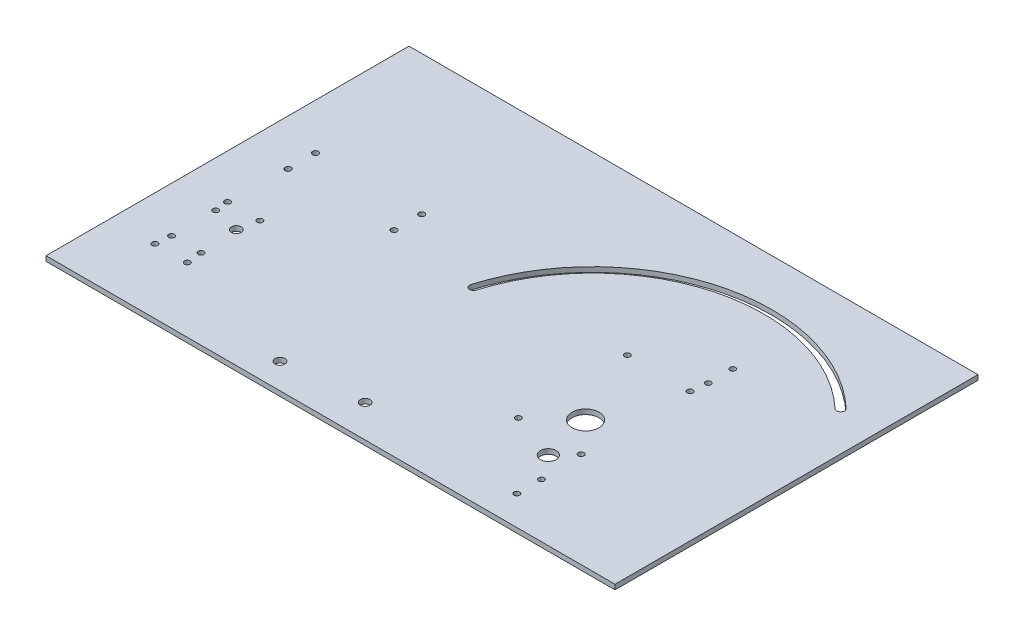
ISO-10303-21;
HEADER;
FILE_DESCRIPTION(('STEP AP214'),'2;1');
FILE_NAME('part.step','',(''),(''),'','','');
FILE_SCHEMA(('AUTOMOTIVE_DESIGN { 1 0 10303 214 1 1 1 1 }'));
ENDSEC;
DATA;
#1=APPLICATION_CONTEXT('core data for automotive mechanical design processes');
#2=APPLICATION_PROTOCOL_DEFINITION('international standard','automotive_design',2000,#1);
#3=PRODUCT_CONTEXT('',#1,'mechanical');
#4=PRODUCT('Part','Part','',(#3));
#5=PRODUCT_RELATED_PRODUCT_CATEGORY('part','',(#4));
#6=PRODUCT_DEFINITION_FORMATION('','',#4);
#7=PRODUCT_DEFINITION_CONTEXT('part definition',#1,'design');
#8=PRODUCT_DEFINITION('design','',#6,#7);
#9=PRODUCT_DEFINITION_SHAPE('','',#8);
#10=(LENGTH_UNIT() NAMED_UNIT(*) SI_UNIT(.MILLI.,.METRE.));
#11=(NAMED_UNIT(*) PLANE_ANGLE_UNIT() SI_UNIT($,.RADIAN.));
#12=(NAMED_UNIT(*) SI_UNIT($,.STERADIAN.) SOLID_ANGLE_UNIT());
#13=UNCERTAINTY_MEASURE_WITH_UNIT(LENGTH_MEASURE(1.E-05),#10,'distance_accuracy_value','');
#14=(GEOMETRIC_REPRESENTATION_CONTEXT(3) GLOBAL_UNCERTAINTY_ASSIGNED_CONTEXT((#13)) GLOBAL_UNIT_ASSIGNED_CONTEXT((#10,
#11,#12)) REPRESENTATION_CONTEXT('',''));
#15=CARTESIAN_POINT('',(0.,0.,0.));
#16=DIRECTION('',(0.,0.,1.));
#17=DIRECTION('',(1.,0.,0.));
#18=AXIS2_PLACEMENT_3D('',#15,#16,#17);
#19=CARTESIAN_POINT('',(0.,3.175,0.));
#20=DIRECTION('',(0.,1.,0.));
#21=DIRECTION('',(0.,0.,1.));
#22=AXIS2_PLACEMENT_3D('',#19,#20,#21);
#23=PLANE('',#22);
#24=CARTESIAN_POINT('',(106.410453434672,3.175,0.373429287609625));
#25=DIRECTION('',(0.,-1.,0.));
#26=DIRECTION('',(0.,0.,1.));
#27=AXIS2_PLACEMENT_3D('',#24,#25,#26);
#28=CIRCLE('',#27,116.205);
#29=CARTESIAN_POINT('',(-5.05726801654176,3.175,-32.4678419952538));
#30=VERTEX_POINT('',#29);
#31=CARTESIAN_POINT('',(185.887196571292,3.175,-84.4030375259801));
#32=VERTEX_POINT('',#31);
#33=EDGE_CURVE('E109',#30,#32,#28,.T.);
#34=ORIENTED_EDGE('',*,*,#33,.T.);
#35=CARTESIAN_POINT('',(184.15,3.175,-82.55));
#36=DIRECTION('',(0.,-1.,0.));
#37=DIRECTION('',(0.,0.,-1.));
#38=AXIS2_PLACEMENT_3D('',#35,#36,#37);
#39=CIRCLE('',#38,2.54);
#40=CARTESIAN_POINT('',(182.412803428708,3.175,-80.6969624740199));
#41=VERTEX_POINT('',#40);
#42=EDGE_CURVE('E118',#32,#41,#39,.T.);
#43=ORIENTED_EDGE('',*,*,#42,.T.);
#44=CARTESIAN_POINT('',(106.410453434672,3.175,0.373429287609625));
#45=DIRECTION('',(0.,1.,0.));
#46=DIRECTION('',(0.,0.,1.));
#47=AXIS2_PLACEMENT_3D('',#44,#45,#46);
#48=CIRCLE('',#47,111.125);
#49=CARTESIAN_POINT('',(-0.184362160750962,3.175,-31.0321580047462));
#50=VERTEX_POINT('',#49);
#51=EDGE_CURVE('E57',#41,#50,#48,.T.);
#52=ORIENTED_EDGE('',*,*,#51,.T.);
#53=CARTESIAN_POINT('',(-2.62081508864638,3.175,-31.75));
#54=DIRECTION('',(0.,-1.,0.));
#55=DIRECTION('',(0.,0.,-1.));
#56=AXIS2_PLACEMENT_3D('',#53,#54,#55);
#57=CIRCLE('',#56,2.54000000000001);
#58=EDGE_CURVE('E115',#50,#30,#57,.T.);
#59=ORIENTED_EDGE('',*,*,#58,.T.);
#60=EDGE_LOOP('',(#34,#43,#52,#59));
#61=FACE_BOUND('',#60,.T.);
#62=DIRECTION('',(1.,0.,0.));
#63=VECTOR('',#62,1.);
#64=CARTESIAN_POINT('',(-158.75,3.175,-146.05));
#65=LINE('',#64,#63);
#66=CARTESIAN_POINT('',(-158.75,3.175,-146.05));
#67=VERTEX_POINT('',#66);
#68=CARTESIAN_POINT('',(209.55,3.175,-146.05));
#69=VERTEX_POINT('',#68);
#70=EDGE_CURVE('E143',#67,#69,#65,.T.);
#71=ORIENTED_EDGE('',*,*,#70,.F.);
#72=DIRECTION('',(0.,0.,1.));
#73=VECTOR('',#72,1.);
#74=CARTESIAN_POINT('',(-158.75,3.175,-88.9));
#75=LINE('',#74,#73);
#76=CARTESIAN_POINT('',(-158.75,3.175,88.9));
#77=VERTEX_POINT('',#76);
#78=EDGE_CURVE('E307',#67,#77,#75,.T.);
#79=ORIENTED_EDGE('',*,*,#78,.T.);
#80=DIRECTION('',(1.,0.,0.));
#81=VECTOR('',#80,1.);
#82=CARTESIAN_POINT('',(-158.75,3.175,88.9));
#83=LINE('',#82,#81);
#84=CARTESIAN_POINT('',(209.55,3.175,88.9));
#85=VERTEX_POINT('',#84);
#86=EDGE_CURVE('E50',#77,#85,#83,.T.);
#87=ORIENTED_EDGE('',*,*,#86,.T.);
#88=DIRECTION('',(0.,0.,1.));
#89=VECTOR('',#88,1.);
#90=CARTESIAN_POINT('',(209.55,3.175,-146.05));
#91=LINE('',#90,#89);
#92=EDGE_CURVE('E146',#69,#85,#91,.T.);
#93=ORIENTED_EDGE('',*,*,#92,.F.);
#94=EDGE_LOOP('',(#71,#79,#87,#93));
#95=FACE_BOUND('',#94,.T.);
#96=CARTESIAN_POINT('',(-129.2225,3.175,37.1475));
#97=DIRECTION('',(0.,1.,0.));
#98=DIRECTION('',(0.,0.,1.));
#99=AXIS2_PLACEMENT_3D('',#96,#97,#98);
#100=CIRCLE('',#99,1.84149999999993);
#101=CARTESIAN_POINT('',(-129.2225,3.175,38.989));
#102=VERTEX_POINT('',#101);
#103=EDGE_CURVE('E187',#102,#102,#100,.T.);
#104=ORIENTED_EDGE('',*,*,#103,.F.);
#105=EDGE_LOOP('',(#104));
#106=FACE_BOUND('',#105,.T.);
#107=CARTESIAN_POINT('',(-130.175,3.175,46.99));
#108=DIRECTION('',(0.,1.,0.));
#109=DIRECTION('',(0.,0.,1.));
#110=AXIS2_PLACEMENT_3D('',#107,#108,#109);
#111=CIRCLE('',#110,1.84149999999999);
#112=CARTESIAN_POINT('',(-130.175,3.175,48.8315));
#113=VERTEX_POINT('',#112);
#114=EDGE_CURVE('E194',#113,#113,#111,.T.);
#115=ORIENTED_EDGE('',*,*,#114,.F.);
#116=EDGE_LOOP('',(#115));
#117=FACE_BOUND('',#116,.T.);
#118=CARTESIAN_POINT('',(-110.1725,3.175,37.1475));
#119=DIRECTION('',(0.,1.,0.));
#120=DIRECTION('',(0.,0.,1.));
#121=AXIS2_PLACEMENT_3D('',#118,#119,#120);
#122=CIRCLE('',#121,1.84149999999996);
#123=CARTESIAN_POINT('',(-110.1725,3.175,38.989));
#124=VERTEX_POINT('',#123);
#125=EDGE_CURVE('E175',#124,#124,#122,.T.);
#126=ORIENTED_EDGE('',*,*,#125,.F.);
#127=EDGE_LOOP('',(#126));
#128=FACE_BOUND('',#127,.T.);
#129=CARTESIAN_POINT('',(-129.2225,3.175,8.57250000000002));
#130=DIRECTION('',(0.,1.,0.));
#131=DIRECTION('',(0.,0.,1.));
#132=AXIS2_PLACEMENT_3D('',#129,#130,#131);
#133=CIRCLE('',#132,1.84150000000002);
#134=CARTESIAN_POINT('',(-129.2225,3.175,10.414));
#135=VERTEX_POINT('',#134);
#136=EDGE_CURVE('E182',#135,#135,#133,.T.);
#137=ORIENTED_EDGE('',*,*,#136,.F.);
#138=EDGE_LOOP('',(#137));
#139=FACE_BOUND('',#138,.T.);
#140=CARTESIAN_POINT('',(85.0900000000001,3.175,-43.4975));
#141=DIRECTION('',(0.,1.,0.));
#142=DIRECTION('',(0.,0.,1.));
#143=AXIS2_PLACEMENT_3D('',#140,#141,#142);
#144=CIRCLE('',#143,1.84150000000004);
#145=CARTESIAN_POINT('',(85.0900000000001,3.175,-41.6559999999999));
#146=VERTEX_POINT('',#145);
#147=EDGE_CURVE('E211',#146,#146,#144,.T.);
#148=ORIENTED_EDGE('',*,*,#147,.F.);
#149=EDGE_LOOP('',(#148));
#150=FACE_BOUND('',#149,.T.);
#151=CARTESIAN_POINT('',(85.0900000000001,3.175,26.9875));
#152=DIRECTION('',(0.,1.,0.));
#153=DIRECTION('',(0.,0.,1.));
#154=AXIS2_PLACEMENT_3D('',#151,#152,#153);
#155=CIRCLE('',#154,1.84149999999996);
#156=CARTESIAN_POINT('',(85.0900000000001,3.175,28.829));
#157=VERTEX_POINT('',#156);
#158=EDGE_CURVE('E218',#157,#157,#155,.T.);
#159=ORIENTED_EDGE('',*,*,#158,.F.);
#160=EDGE_LOOP('',(#159));
#161=FACE_BOUND('',#160,.T.);
#162=CARTESIAN_POINT('',(125.73,3.175,26.9875));
#163=DIRECTION('',(0.,1.,0.));
#164=DIRECTION('',(0.,0.,1.));
#165=AXIS2_PLACEMENT_3D('',#162,#163,#164);
#166=CIRCLE('',#165,1.84149999999999);
#167=CARTESIAN_POINT('',(125.73,3.175,28.829));
#168=VERTEX_POINT('',#167);
#169=EDGE_CURVE('E199',#168,#168,#166,.T.);
#170=ORIENTED_EDGE('',*,*,#169,.F.);
#171=EDGE_LOOP('',(#170));
#172=FACE_BOUND('',#171,.T.);
#173=CARTESIAN_POINT('',(-109.22,3.175,46.99));
#174=DIRECTION('',(0.,1.,0.));
#175=DIRECTION('',(0.,0.,1.));
#176=AXIS2_PLACEMENT_3D('',#173,#174,#175);
#177=CIRCLE('',#176,1.8415);
#178=CARTESIAN_POINT('',(-109.22,3.175,48.8315));
#179=VERTEX_POINT('',#178);
#180=EDGE_CURVE('E206',#179,#179,#177,.T.);
#181=ORIENTED_EDGE('',*,*,#180,.F.);
#182=EDGE_LOOP('',(#181));
#183=FACE_BOUND('',#182,.T.);
#184=CARTESIAN_POINT('',(-130.175,3.175,0.));
#185=DIRECTION('',(0.,1.,0.));
#186=DIRECTION('',(0.,0.,1.));
#187=AXIS2_PLACEMENT_3D('',#184,#185,#186);
#188=CIRCLE('',#187,1.84149999999999);
#189=CARTESIAN_POINT('',(-130.175,3.175,1.8415));
#190=VERTEX_POINT('',#189);
#191=EDGE_CURVE('E163',#190,#190,#188,.T.);
#192=ORIENTED_EDGE('',*,*,#191,.F.);
#193=EDGE_LOOP('',(#192));
#194=FACE_BOUND('',#193,.T.);
#195=CARTESIAN_POINT('',(-109.22,3.175,0.));
#196=DIRECTION('',(0.,1.,0.));
#197=DIRECTION('',(0.,0.,1.));
#198=AXIS2_PLACEMENT_3D('',#195,#196,#197);
#199=CIRCLE('',#198,1.8415);
#200=CARTESIAN_POINT('',(-109.22,3.175,1.84150000000001));
#201=VERTEX_POINT('',#200);
#202=EDGE_CURVE('E170',#201,#201,#199,.T.);
#203=ORIENTED_EDGE('',*,*,#202,.F.);
#204=EDGE_LOOP('',(#203));
#205=FACE_BOUND('',#204,.T.);
#206=CARTESIAN_POINT('',(125.73,3.175,-43.4975));
#207=DIRECTION('',(0.,1.,0.));
#208=DIRECTION('',(0.,0.,1.));
#209=AXIS2_PLACEMENT_3D('',#206,#207,#208);
#210=CIRCLE('',#209,1.84150000000002);
#211=CARTESIAN_POINT('',(125.73,3.175,-41.6559999999999));
#212=VERTEX_POINT('',#211);
#213=EDGE_CURVE('E214',#212,#212,#210,.T.);
#214=ORIENTED_EDGE('',*,*,#213,.F.);
#215=EDGE_LOOP('',(#214));
#216=FACE_BOUND('',#215,.T.);
#217=CARTESIAN_POINT('',(127.,3.175,69.85));
#218=DIRECTION('',(0.,-1.,0.));
#219=DIRECTION('',(0.,0.,-1.));
#220=AXIS2_PLACEMENT_3D('',#217,#218,#219);
#221=CIRCLE('',#220,1.80340000000001);
#222=CARTESIAN_POINT('',(127.,3.175,68.0466));
#223=VERTEX_POINT('',#222);
#224=EDGE_CURVE('E229',#223,#223,#221,.T.);
#225=ORIENTED_EDGE('',*,*,#224,.T.);
#226=EDGE_LOOP('',(#225));
#227=FACE_BOUND('',#226,.T.);
#228=CARTESIAN_POINT('',(127.,3.175,53.975));
#229=DIRECTION('',(0.,-1.,0.));
#230=DIRECTION('',(0.,0.,-1.));
#231=AXIS2_PLACEMENT_3D('',#228,#229,#230);
#232=CIRCLE('',#231,1.80340000000001);
#233=CARTESIAN_POINT('',(127.,3.175,52.1716));
#234=VERTEX_POINT('',#233);
#235=EDGE_CURVE('E239',#234,#234,#232,.T.);
#236=ORIENTED_EDGE('',*,*,#235,.T.);
#237=EDGE_LOOP('',(#236));
#238=FACE_BOUND('',#237,.T.);
#239=CARTESIAN_POINT('',(127.,3.175,-53.975));
#240=DIRECTION('',(0.,-1.,0.));
#241=DIRECTION('',(0.,0.,-1.));
#242=AXIS2_PLACEMENT_3D('',#239,#240,#241);
#243=CIRCLE('',#242,1.80340000000001);
#244=CARTESIAN_POINT('',(127.,3.175,-55.7784));
#245=VERTEX_POINT('',#244);
#246=EDGE_CURVE('E245',#245,#245,#243,.T.);
#247=ORIENTED_EDGE('',*,*,#246,.T.);
#248=EDGE_LOOP('',(#247));
#249=FACE_BOUND('',#248,.T.);
#250=CARTESIAN_POINT('',(127.,3.175,-69.85));
#251=DIRECTION('',(0.,-1.,0.));
#252=DIRECTION('',(0.,0.,-1.));
#253=AXIS2_PLACEMENT_3D('',#250,#251,#252);
#254=CIRCLE('',#253,1.80340000000001);
#255=CARTESIAN_POINT('',(127.,3.175,-71.6534));
#256=VERTEX_POINT('',#255);
#257=EDGE_CURVE('E226',#256,#256,#254,.T.);
#258=ORIENTED_EDGE('',*,*,#257,.T.);
#259=EDGE_LOOP('',(#258));
#260=FACE_BOUND('',#259,.T.);
#261=CARTESIAN_POINT('',(115.57,3.175,38.1));
#262=DIRECTION('',(0.,1.,0.));
#263=DIRECTION('',(0.,0.,1.));
#264=AXIS2_PLACEMENT_3D('',#261,#262,#263);
#265=CIRCLE('',#264,5.08000000000001);
#266=CARTESIAN_POINT('',(115.57,3.175,43.18));
#267=VERTEX_POINT('',#266);
#268=EDGE_CURVE('E232',#267,#267,#265,.T.);
#269=ORIENTED_EDGE('',*,*,#268,.F.);
#270=EDGE_LOOP('',(#269));
#271=FACE_BOUND('',#270,.T.);
#272=CARTESIAN_POINT('',(-23.829539608584,3.175,72.39));
#273=DIRECTION('',(0.,-1.,0.));
#274=DIRECTION('',(0.,0.,-1.));
#275=AXIS2_PLACEMENT_3D('',#272,#273,#274);
#276=CIRCLE('',#275,3.175);
#277=CARTESIAN_POINT('',(-23.829539608584,3.175,69.215));
#278=VERTEX_POINT('',#277);
#279=EDGE_CURVE('E259',#278,#278,#276,.T.);
#280=ORIENTED_EDGE('',*,*,#279,.T.);
#281=EDGE_LOOP('',(#280));
#282=FACE_BOUND('',#281,.T.);
#283=CARTESIAN_POINT('',(26.764302072,3.175,67.818));
#284=DIRECTION('',(0.,-1.,0.));
#285=DIRECTION('',(0.,0.,-1.));
#286=AXIS2_PLACEMENT_3D('',#283,#284,#285);
#287=CIRCLE('',#286,3.175);
#288=CARTESIAN_POINT('',(26.764302072,3.175,64.643));
#289=VERTEX_POINT('',#288);
#290=EDGE_CURVE('E266',#289,#289,#287,.T.);
#291=ORIENTED_EDGE('',*,*,#290,.T.);
#292=EDGE_LOOP('',(#291));
#293=FACE_BOUND('',#292,.T.);
#294=CARTESIAN_POINT('',(-129.032,3.175,-38.1));
#295=DIRECTION('',(0.,1.,0.));
#296=DIRECTION('',(0.,0.,1.));
#297=AXIS2_PLACEMENT_3D('',#294,#295,#296);
#298=CIRCLE('',#297,1.90499999999999);
#299=CARTESIAN_POINT('',(-129.032,3.175,-36.195));
#300=VERTEX_POINT('',#299);
#301=EDGE_CURVE('E277',#300,#300,#298,.T.);
#302=ORIENTED_EDGE('',*,*,#301,.F.);
#303=EDGE_LOOP('',(#302));
#304=FACE_BOUND('',#303,.T.);
#305=CARTESIAN_POINT('',(-129.032,3.175,-55.88));
#306=DIRECTION('',(0.,1.,0.));
#307=DIRECTION('',(0.,0.,1.));
#308=AXIS2_PLACEMENT_3D('',#305,#306,#307);
#309=CIRCLE('',#308,1.90499999999999);
#310=CARTESIAN_POINT('',(-129.032,3.175,-53.975));
#311=VERTEX_POINT('',#310);
#312=EDGE_CURVE('E289',#311,#311,#309,.T.);
#313=ORIENTED_EDGE('',*,*,#312,.F.);
#314=EDGE_LOOP('',(#313));
#315=FACE_BOUND('',#314,.T.);
#316=CARTESIAN_POINT('',(-111.76,3.175,12.7));
#317=DIRECTION('',(0.,1.,0.));
#318=DIRECTION('',(0.,0.,1.));
#319=AXIS2_PLACEMENT_3D('',#316,#317,#318);
#320=CIRCLE('',#319,3.175);
#321=CARTESIAN_POINT('',(-111.76,3.175,15.875));
#322=VERTEX_POINT('',#321);
#323=EDGE_CURVE('E301',#322,#322,#320,.T.);
#324=ORIENTED_EDGE('',*,*,#323,.F.);
#325=EDGE_LOOP('',(#324));
#326=FACE_BOUND('',#325,.T.);
#327=CARTESIAN_POINT('',(107.95,3.175,6.35000000000002));
#328=DIRECTION('',(0.,1.,0.));
#329=DIRECTION('',(0.,0.,1.));
#330=AXIS2_PLACEMENT_3D('',#327,#328,#329);
#331=CIRCLE('',#330,8.73125);
#332=CARTESIAN_POINT('',(107.95,3.175,15.08125));
#333=VERTEX_POINT('',#332);
#334=EDGE_CURVE('E295',#333,#333,#331,.T.);
#335=ORIENTED_EDGE('',*,*,#334,.F.);
#336=EDGE_LOOP('',(#335));
#337=FACE_BOUND('',#336,.T.);
#338=CARTESIAN_POINT('',(-60.452,3.175,-55.88));
#339=DIRECTION('',(0.,1.,0.));
#340=DIRECTION('',(0.,0.,1.));
#341=AXIS2_PLACEMENT_3D('',#338,#339,#340);
#342=CIRCLE('',#341,1.90500000000001);
#343=CARTESIAN_POINT('',(-60.452,3.175,-53.975));
#344=VERTEX_POINT('',#343);
#345=EDGE_CURVE('E283',#344,#344,#342,.T.);
#346=ORIENTED_EDGE('',*,*,#345,.F.);
#347=EDGE_LOOP('',(#346));
#348=FACE_BOUND('',#347,.T.);
#349=CARTESIAN_POINT('',(-60.452,3.175,-38.1));
#350=DIRECTION('',(0.,1.,0.));
#351=DIRECTION('',(0.,0.,1.));
#352=AXIS2_PLACEMENT_3D('',#349,#350,#351);
#353=CIRCLE('',#352,1.90500000000001);
#354=CARTESIAN_POINT('',(-60.452,3.175,-36.195));
#355=VERTEX_POINT('',#354);
#356=EDGE_CURVE('E271',#355,#355,#353,.T.);
#357=ORIENTED_EDGE('',*,*,#356,.F.);
#358=EDGE_LOOP('',(#357));
#359=FACE_BOUND('',#358,.T.);
#360=ADVANCED_FACE('F42',(#61,#95,#106,#117,#128,#139,#150,#161,#172,#183,#194,#205,#216,#227,
#238,#249,#260,#271,#282,#293,#304,#315,#326,#337,#348,#359),#23,.T.);
#361=CARTESIAN_POINT('',(0.,0.,0.));
#362=DIRECTION('',(0.,1.,0.));
#363=DIRECTION('',(0.,0.,1.));
#364=AXIS2_PLACEMENT_3D('',#361,#362,#363);
#365=PLANE('',#364);
#366=CARTESIAN_POINT('',(184.15,0.,-82.55));
#367=DIRECTION('',(0.,-1.,0.));
#368=DIRECTION('',(0.,0.,-1.));
#369=AXIS2_PLACEMENT_3D('',#366,#367,#368);
#370=CIRCLE('',#369,2.54);
#371=CARTESIAN_POINT('',(185.887196571292,0.,-84.4030375259801));
#372=VERTEX_POINT('',#371);
#373=CARTESIAN_POINT('',(182.412803428708,0.,-80.6969624740199));
#374=VERTEX_POINT('',#373);
#375=EDGE_CURVE('E133',#372,#374,#370,.T.);
#376=ORIENTED_EDGE('',*,*,#375,.F.);
#377=CARTESIAN_POINT('',(106.410453434672,0.,0.373429287609625));
#378=DIRECTION('',(0.,-1.,0.));
#379=DIRECTION('',(0.,0.,1.));
#380=AXIS2_PLACEMENT_3D('',#377,#378,#379);
#381=CIRCLE('',#380,116.205);
#382=CARTESIAN_POINT('',(-5.05726801654176,0.,-32.4678419952538));
#383=VERTEX_POINT('',#382);
#384=EDGE_CURVE('E65',#383,#372,#381,.T.);
#385=ORIENTED_EDGE('',*,*,#384,.F.);
#386=CARTESIAN_POINT('',(-2.62081508864638,0.,-31.75));
#387=DIRECTION('',(0.,-1.,0.));
#388=DIRECTION('',(0.,0.,-1.));
#389=AXIS2_PLACEMENT_3D('',#386,#387,#388);
#390=CIRCLE('',#389,2.54000000000001);
#391=CARTESIAN_POINT('',(-0.184362160750962,0.,-31.0321580047462));
#392=VERTEX_POINT('',#391);
#393=EDGE_CURVE('E124',#392,#383,#390,.T.);
#394=ORIENTED_EDGE('',*,*,#393,.F.);
#395=CARTESIAN_POINT('',(106.410453434672,0.,0.373429287609625));
#396=DIRECTION('',(0.,1.,0.));
#397=DIRECTION('',(0.,0.,1.));
#398=AXIS2_PLACEMENT_3D('',#395,#396,#397);
#399=CIRCLE('',#398,111.125);
#400=EDGE_CURVE('E127',#374,#392,#399,.T.);
#401=ORIENTED_EDGE('',*,*,#400,.F.);
#402=EDGE_LOOP('',(#376,#385,#394,#401));
#403=FACE_BOUND('',#402,.T.);
#404=DIRECTION('',(0.,0.,1.));
#405=VECTOR('',#404,1.);
#406=CARTESIAN_POINT('',(-158.75,0.,-88.9));
#407=LINE('',#406,#405);
#408=CARTESIAN_POINT('',(-158.75,0.,-146.05));
#409=VERTEX_POINT('',#408);
#410=CARTESIAN_POINT('',(-158.75,0.,88.9));
#411=VERTEX_POINT('',#410);
#412=EDGE_CURVE('E304',#409,#411,#407,.T.);
#413=ORIENTED_EDGE('',*,*,#412,.F.);
#414=DIRECTION('',(1.,0.,0.));
#415=VECTOR('',#414,1.);
#416=CARTESIAN_POINT('',(-158.75,0.,-146.05));
#417=LINE('',#416,#415);
#418=CARTESIAN_POINT('',(209.55,0.,-146.05));
#419=VERTEX_POINT('',#418);
#420=EDGE_CURVE('E139',#409,#419,#417,.T.);
#421=ORIENTED_EDGE('',*,*,#420,.T.);
#422=DIRECTION('',(0.,0.,1.));
#423=VECTOR('',#422,1.);
#424=CARTESIAN_POINT('',(209.55,0.,-146.05));
#425=LINE('',#424,#423);
#426=CARTESIAN_POINT('',(209.55,0.,88.9));
#427=VERTEX_POINT('',#426);
#428=EDGE_CURVE('E147',#419,#427,#425,.T.);
#429=ORIENTED_EDGE('',*,*,#428,.T.);
#430=DIRECTION('',(1.,0.,0.));
#431=VECTOR('',#430,1.);
#432=CARTESIAN_POINT('',(-158.75,0.,88.9));
#433=LINE('',#432,#431);
#434=EDGE_CURVE('E309',#411,#427,#433,.T.);
#435=ORIENTED_EDGE('',*,*,#434,.F.);
#436=EDGE_LOOP('',(#413,#421,#429,#435));
#437=FACE_BOUND('',#436,.T.);
#438=CARTESIAN_POINT('',(-129.2225,0.,37.1475));
#439=DIRECTION('',(0.,1.,0.));
#440=DIRECTION('',(0.,0.,1.));
#441=AXIS2_PLACEMENT_3D('',#438,#439,#440);
#442=CIRCLE('',#441,1.84149999999993);
#443=CARTESIAN_POINT('',(-129.2225,0.,38.989));
#444=VERTEX_POINT('',#443);
#445=EDGE_CURVE('E191',#444,#444,#442,.T.);
#446=ORIENTED_EDGE('',*,*,#445,.T.);
#447=EDGE_LOOP('',(#446));
#448=FACE_BOUND('',#447,.T.);
#449=CARTESIAN_POINT('',(-130.175,0.,46.99));
#450=DIRECTION('',(0.,1.,0.));
#451=DIRECTION('',(0.,0.,1.));
#452=AXIS2_PLACEMENT_3D('',#449,#450,#451);
#453=CIRCLE('',#452,1.84149999999999);
#454=CARTESIAN_POINT('',(-130.175,0.,48.8315));
#455=VERTEX_POINT('',#454);
#456=EDGE_CURVE('E178',#455,#455,#453,.T.);
#457=ORIENTED_EDGE('',*,*,#456,.T.);
#458=EDGE_LOOP('',(#457));
#459=FACE_BOUND('',#458,.T.);
#460=CARTESIAN_POINT('',(-110.1725,0.,37.1475));
#461=DIRECTION('',(0.,1.,0.));
#462=DIRECTION('',(0.,0.,1.));
#463=AXIS2_PLACEMENT_3D('',#460,#461,#462);
#464=CIRCLE('',#463,1.84149999999996);
#465=CARTESIAN_POINT('',(-110.1725,0.,38.989));
#466=VERTEX_POINT('',#465);
#467=EDGE_CURVE('E179',#466,#466,#464,.T.);
#468=ORIENTED_EDGE('',*,*,#467,.T.);
#469=EDGE_LOOP('',(#468));
#470=FACE_BOUND('',#469,.T.);
#471=CARTESIAN_POINT('',(-129.2225,0.,8.57250000000002));
#472=DIRECTION('',(0.,1.,0.));
#473=DIRECTION('',(0.,0.,1.));
#474=AXIS2_PLACEMENT_3D('',#471,#472,#473);
#475=CIRCLE('',#474,1.84150000000002);
#476=CARTESIAN_POINT('',(-129.2225,0.,10.414));
#477=VERTEX_POINT('',#476);
#478=EDGE_CURVE('E166',#477,#477,#475,.T.);
#479=ORIENTED_EDGE('',*,*,#478,.T.);
#480=EDGE_LOOP('',(#479));
#481=FACE_BOUND('',#480,.T.);
#482=CARTESIAN_POINT('',(85.0900000000001,0.,-43.4975));
#483=DIRECTION('',(0.,1.,0.));
#484=DIRECTION('',(0.,0.,1.));
#485=AXIS2_PLACEMENT_3D('',#482,#483,#484);
#486=CIRCLE('',#485,1.84150000000004);
#487=CARTESIAN_POINT('',(85.0900000000001,0.,-41.6559999999999));
#488=VERTEX_POINT('',#487);
#489=EDGE_CURVE('E215',#488,#488,#486,.T.);
#490=ORIENTED_EDGE('',*,*,#489,.T.);
#491=EDGE_LOOP('',(#490));
#492=FACE_BOUND('',#491,.T.);
#493=CARTESIAN_POINT('',(85.0900000000001,0.,26.9875));
#494=DIRECTION('',(0.,1.,0.));
#495=DIRECTION('',(0.,0.,1.));
#496=AXIS2_PLACEMENT_3D('',#493,#494,#495);
#497=CIRCLE('',#496,1.84149999999996);
#498=CARTESIAN_POINT('',(85.0900000000001,0.,28.829));
#499=VERTEX_POINT('',#498);
#500=EDGE_CURVE('E202',#499,#499,#497,.T.);
#501=ORIENTED_EDGE('',*,*,#500,.T.);
#502=EDGE_LOOP('',(#501));
#503=FACE_BOUND('',#502,.T.);
#504=CARTESIAN_POINT('',(125.73,0.,26.9875));
#505=DIRECTION('',(0.,1.,0.));
#506=DIRECTION('',(0.,0.,1.));
#507=AXIS2_PLACEMENT_3D('',#504,#505,#506);
#508=CIRCLE('',#507,1.84149999999999);
#509=CARTESIAN_POINT('',(125.73,0.,28.829));
#510=VERTEX_POINT('',#509);
#511=EDGE_CURVE('E203',#510,#510,#508,.T.);
#512=ORIENTED_EDGE('',*,*,#511,.T.);
#513=EDGE_LOOP('',(#512));
#514=FACE_BOUND('',#513,.T.);
#515=CARTESIAN_POINT('',(-109.22,0.,46.99));
#516=DIRECTION('',(0.,1.,0.));
#517=DIRECTION('',(0.,0.,1.));
#518=AXIS2_PLACEMENT_3D('',#515,#516,#517);
#519=CIRCLE('',#518,1.8415);
#520=CARTESIAN_POINT('',(-109.22,0.,48.8315));
#521=VERTEX_POINT('',#520);
#522=EDGE_CURVE('E190',#521,#521,#519,.T.);
#523=ORIENTED_EDGE('',*,*,#522,.T.);
#524=EDGE_LOOP('',(#523));
#525=FACE_BOUND('',#524,.T.);
#526=CARTESIAN_POINT('',(-130.175,0.,0.));
#527=DIRECTION('',(0.,1.,0.));
#528=DIRECTION('',(0.,0.,1.));
#529=AXIS2_PLACEMENT_3D('',#526,#527,#528);
#530=CIRCLE('',#529,1.84149999999999);
#531=CARTESIAN_POINT('',(-130.175,0.,1.8415));
#532=VERTEX_POINT('',#531);
#533=EDGE_CURVE('E167',#532,#532,#530,.T.);
#534=ORIENTED_EDGE('',*,*,#533,.T.);
#535=EDGE_LOOP('',(#534));
#536=FACE_BOUND('',#535,.T.);
#537=CARTESIAN_POINT('',(-109.22,0.,0.));
#538=DIRECTION('',(0.,1.,0.));
#539=DIRECTION('',(0.,0.,1.));
#540=AXIS2_PLACEMENT_3D('',#537,#538,#539);
#541=CIRCLE('',#540,1.8415);
#542=CARTESIAN_POINT('',(-109.22,0.,1.84150000000001));
#543=VERTEX_POINT('',#542);
#544=EDGE_CURVE('E158',#543,#543,#541,.T.);
#545=ORIENTED_EDGE('',*,*,#544,.T.);
#546=EDGE_LOOP('',(#545));
#547=FACE_BOUND('',#546,.T.);
#548=CARTESIAN_POINT('',(125.73,0.,-43.4975));
#549=DIRECTION('',(0.,1.,0.));
#550=DIRECTION('',(0.,0.,1.));
#551=AXIS2_PLACEMENT_3D('',#548,#549,#550);
#552=CIRCLE('',#551,1.84150000000002);
#553=CARTESIAN_POINT('',(125.73,0.,-41.6559999999999));
#554=VERTEX_POINT('',#553);
#555=EDGE_CURVE('E223',#554,#554,#552,.T.);
#556=ORIENTED_EDGE('',*,*,#555,.T.);
#557=EDGE_LOOP('',(#556));
#558=FACE_BOUND('',#557,.T.);
#559=CARTESIAN_POINT('',(127.,0.,69.85));
#560=DIRECTION('',(0.,-1.,0.));
#561=DIRECTION('',(0.,0.,-1.));
#562=AXIS2_PLACEMENT_3D('',#559,#560,#561);
#563=CIRCLE('',#562,1.80340000000001);
#564=CARTESIAN_POINT('',(127.,0.,68.0466));
#565=VERTEX_POINT('',#564);
#566=EDGE_CURVE('E233',#565,#565,#563,.T.);
#567=ORIENTED_EDGE('',*,*,#566,.F.);
#568=EDGE_LOOP('',(#567));
#569=FACE_BOUND('',#568,.T.);
#570=CARTESIAN_POINT('',(127.,0.,53.975));
#571=DIRECTION('',(0.,-1.,0.));
#572=DIRECTION('',(0.,0.,-1.));
#573=AXIS2_PLACEMENT_3D('',#570,#571,#572);
#574=CIRCLE('',#573,1.80340000000001);
#575=CARTESIAN_POINT('',(127.,0.,52.1716));
#576=VERTEX_POINT('',#575);
#577=EDGE_CURVE('E236',#576,#576,#574,.T.);
#578=ORIENTED_EDGE('',*,*,#577,.F.);
#579=EDGE_LOOP('',(#578));
#580=FACE_BOUND('',#579,.T.);
#581=CARTESIAN_POINT('',(127.,0.,-53.975));
#582=DIRECTION('',(0.,-1.,0.));
#583=DIRECTION('',(0.,0.,-1.));
#584=AXIS2_PLACEMENT_3D('',#581,#582,#583);
#585=CIRCLE('',#584,1.80340000000001);
#586=CARTESIAN_POINT('',(127.,0.,-55.7784));
#587=VERTEX_POINT('',#586);
#588=EDGE_CURVE('E242',#587,#587,#585,.T.);
#589=ORIENTED_EDGE('',*,*,#588,.F.);
#590=EDGE_LOOP('',(#589));
#591=FACE_BOUND('',#590,.T.);
#592=CARTESIAN_POINT('',(127.,0.,-69.85));
#593=DIRECTION('',(0.,-1.,0.));
#594=DIRECTION('',(0.,0.,-1.));
#595=AXIS2_PLACEMENT_3D('',#592,#593,#594);
#596=CIRCLE('',#595,1.80340000000001);
#597=CARTESIAN_POINT('',(127.,0.,-71.6534));
#598=VERTEX_POINT('',#597);
#599=EDGE_CURVE('E248',#598,#598,#596,.T.);
#600=ORIENTED_EDGE('',*,*,#599,.F.);
#601=EDGE_LOOP('',(#600));
#602=FACE_BOUND('',#601,.T.);
#603=CARTESIAN_POINT('',(115.57,0.,38.1));
#604=DIRECTION('',(0.,1.,0.));
#605=DIRECTION('',(0.,0.,1.));
#606=AXIS2_PLACEMENT_3D('',#603,#604,#605);
#607=CIRCLE('',#606,5.08000000000001);
#608=CARTESIAN_POINT('',(115.57,0.,43.18));
#609=VERTEX_POINT('',#608);
#610=EDGE_CURVE('E253',#609,#609,#607,.T.);
#611=ORIENTED_EDGE('',*,*,#610,.T.);
#612=EDGE_LOOP('',(#611));
#613=FACE_BOUND('',#612,.T.);
#614=CARTESIAN_POINT('',(-23.829539608584,0.,72.39));
#615=DIRECTION('',(0.,-1.,0.));
#616=DIRECTION('',(0.,0.,-1.));
#617=AXIS2_PLACEMENT_3D('',#614,#615,#616);
#618=CIRCLE('',#617,3.175);
#619=CARTESIAN_POINT('',(-23.829539608584,0.,69.215));
#620=VERTEX_POINT('',#619);
#621=EDGE_CURVE('E263',#620,#620,#618,.T.);
#622=ORIENTED_EDGE('',*,*,#621,.F.);
#623=EDGE_LOOP('',(#622));
#624=FACE_BOUND('',#623,.T.);
#625=CARTESIAN_POINT('',(26.764302072,0.,67.818));
#626=DIRECTION('',(0.,-1.,0.));
#627=DIRECTION('',(0.,0.,-1.));
#628=AXIS2_PLACEMENT_3D('',#625,#626,#627);
#629=CIRCLE('',#628,3.175);
#630=CARTESIAN_POINT('',(26.764302072,0.,64.643));
#631=VERTEX_POINT('',#630);
#632=EDGE_CURVE('E256',#631,#631,#629,.T.);
#633=ORIENTED_EDGE('',*,*,#632,.F.);
#634=EDGE_LOOP('',(#633));
#635=FACE_BOUND('',#634,.T.);
#636=CARTESIAN_POINT('',(-111.76,0.,12.7));
#637=DIRECTION('',(0.,1.,0.));
#638=DIRECTION('',(0.,0.,1.));
#639=AXIS2_PLACEMENT_3D('',#636,#637,#638);
#640=CIRCLE('',#639,3.175);
#641=CARTESIAN_POINT('',(-111.76,0.,15.875));
#642=VERTEX_POINT('',#641);
#643=EDGE_CURVE('E298',#642,#642,#640,.T.);
#644=ORIENTED_EDGE('',*,*,#643,.T.);
#645=EDGE_LOOP('',(#644));
#646=FACE_BOUND('',#645,.T.);
#647=CARTESIAN_POINT('',(107.95,0.,6.35000000000002));
#648=DIRECTION('',(0.,1.,0.));
#649=DIRECTION('',(0.,0.,1.));
#650=AXIS2_PLACEMENT_3D('',#647,#648,#649);
#651=CIRCLE('',#650,8.73125);
#652=CARTESIAN_POINT('',(107.95,0.,15.08125));
#653=VERTEX_POINT('',#652);
#654=EDGE_CURVE('E292',#653,#653,#651,.T.);
#655=ORIENTED_EDGE('',*,*,#654,.T.);
#656=EDGE_LOOP('',(#655));
#657=FACE_BOUND('',#656,.T.);
#658=CARTESIAN_POINT('',(-129.032,0.,-55.88));
#659=DIRECTION('',(0.,1.,0.));
#660=DIRECTION('',(0.,0.,1.));
#661=AXIS2_PLACEMENT_3D('',#658,#659,#660);
#662=CIRCLE('',#661,1.90499999999999);
#663=CARTESIAN_POINT('',(-129.032,0.,-53.975));
#664=VERTEX_POINT('',#663);
#665=EDGE_CURVE('E286',#664,#664,#662,.T.);
#666=ORIENTED_EDGE('',*,*,#665,.T.);
#667=EDGE_LOOP('',(#666));
#668=FACE_BOUND('',#667,.T.);
#669=CARTESIAN_POINT('',(-60.452,0.,-55.88));
#670=DIRECTION('',(0.,1.,0.));
#671=DIRECTION('',(0.,0.,1.));
#672=AXIS2_PLACEMENT_3D('',#669,#670,#671);
#673=CIRCLE('',#672,1.90500000000001);
#674=CARTESIAN_POINT('',(-60.452,0.,-53.975));
#675=VERTEX_POINT('',#674);
#676=EDGE_CURVE('E280',#675,#675,#673,.T.);
#677=ORIENTED_EDGE('',*,*,#676,.T.);
#678=EDGE_LOOP('',(#677));
#679=FACE_BOUND('',#678,.T.);
#680=CARTESIAN_POINT('',(-129.032,0.,-38.1));
#681=DIRECTION('',(0.,1.,0.));
#682=DIRECTION('',(0.,0.,1.));
#683=AXIS2_PLACEMENT_3D('',#680,#681,#682);
#684=CIRCLE('',#683,1.90499999999999);
#685=CARTESIAN_POINT('',(-129.032,0.,-36.195));
#686=VERTEX_POINT('',#685);
#687=EDGE_CURVE('E274',#686,#686,#684,.T.);
#688=ORIENTED_EDGE('',*,*,#687,.T.);
#689=EDGE_LOOP('',(#688));
#690=FACE_BOUND('',#689,.T.);
#691=CARTESIAN_POINT('',(-60.452,0.,-38.1));
#692=DIRECTION('',(0.,1.,0.));
#693=DIRECTION('',(0.,0.,1.));
#694=AXIS2_PLACEMENT_3D('',#691,#692,#693);
#695=CIRCLE('',#694,1.90500000000001);
#696=CARTESIAN_POINT('',(-60.452,0.,-36.195));
#697=VERTEX_POINT('',#696);
#698=EDGE_CURVE('E262',#697,#697,#695,.T.);
#699=ORIENTED_EDGE('',*,*,#698,.T.);
#700=EDGE_LOOP('',(#699));
#701=FACE_BOUND('',#700,.T.);
#702=ADVANCED_FACE('F322',(#403,#437,#448,#459,#470,#481,#492,#503,#514,#525,#536,#547,#558,
#569,#580,#591,#602,#613,#624,#635,#646,#657,#668,#679,#690,#701),#365,.F.);
#703=CARTESIAN_POINT('',(-158.75,3.175,-88.9));
#704=DIRECTION('',(1.,0.,0.));
#705=DIRECTION('',(0.,0.,-1.));
#706=AXIS2_PLACEMENT_3D('',#703,#704,#705);
#707=PLANE('',#706);
#708=ORIENTED_EDGE('',*,*,#412,.T.);
#709=DIRECTION('',(0.,-1.,0.));
#710=VECTOR('',#709,1.);
#711=CARTESIAN_POINT('',(-158.75,3.175,88.9));
#712=LINE('',#711,#710);
#713=EDGE_CURVE('E11',#77,#411,#712,.T.);
#714=ORIENTED_EDGE('',*,*,#713,.F.);
#715=ORIENTED_EDGE('',*,*,#78,.F.);
#716=DIRECTION('',(0.,-1.,0.));
#717=VECTOR('',#716,1.);
#718=CARTESIAN_POINT('',(-158.75,3.175,-146.05));
#719=LINE('',#718,#717);
#720=EDGE_CURVE('E150',#67,#409,#719,.T.);
#721=ORIENTED_EDGE('',*,*,#720,.T.);
#722=EDGE_LOOP('',(#708,#714,#715,#721));
#723=FACE_BOUND('',#722,.T.);
#724=ADVANCED_FACE('F44',(#723),#707,.F.);
#725=CARTESIAN_POINT('',(-158.75,3.175,88.9));
#726=DIRECTION('',(0.,0.,-1.));
#727=DIRECTION('',(-1.,0.,0.));
#728=AXIS2_PLACEMENT_3D('',#725,#726,#727);
#729=PLANE('',#728);
#730=ORIENTED_EDGE('',*,*,#434,.T.);
#731=DIRECTION('',(0.,-1.,0.));
#732=VECTOR('',#731,1.);
#733=CARTESIAN_POINT('',(209.55,3.175,88.9));
#734=LINE('',#733,#732);
#735=EDGE_CURVE('E155',#85,#427,#734,.T.);
#736=ORIENTED_EDGE('',*,*,#735,.F.);
#737=ORIENTED_EDGE('',*,*,#86,.F.);
#738=ORIENTED_EDGE('',*,*,#713,.T.);
#739=EDGE_LOOP('',(#730,#736,#737,#738));
#740=FACE_BOUND('',#739,.T.);
#741=ADVANCED_FACE('F314',(#740),#729,.F.);
#742=CARTESIAN_POINT('',(-111.76,3.175,12.7));
#743=DIRECTION('',(0.,-1.,0.));
#744=DIRECTION('',(0.,0.,-1.));
#745=AXIS2_PLACEMENT_3D('',#742,#743,#744);
#746=CYLINDRICAL_SURFACE('',#745,3.175);
#747=ORIENTED_EDGE('',*,*,#323,.T.);
#748=EDGE_LOOP('',(#747));
#749=FACE_BOUND('',#748,.T.);
#750=ORIENTED_EDGE('',*,*,#643,.F.);
#751=EDGE_LOOP('',(#750));
#752=FACE_BOUND('',#751,.T.);
#753=ADVANCED_FACE('F336',(#749,#752),#746,.F.);
#754=CARTESIAN_POINT('',(107.95,3.175,6.35000000000002));
#755=DIRECTION('',(0.,-1.,0.));
#756=DIRECTION('',(0.,0.,-1.));
#757=AXIS2_PLACEMENT_3D('',#754,#755,#756);
#758=CYLINDRICAL_SURFACE('',#757,8.73125);
#759=ORIENTED_EDGE('',*,*,#334,.T.);
#760=EDGE_LOOP('',(#759));
#761=FACE_BOUND('',#760,.T.);
#762=ORIENTED_EDGE('',*,*,#654,.F.);
#763=EDGE_LOOP('',(#762));
#764=FACE_BOUND('',#763,.T.);
#765=ADVANCED_FACE('F348',(#761,#764),#758,.F.);
#766=CARTESIAN_POINT('',(-129.032,3.175,-55.88));
#767=DIRECTION('',(0.,-1.,0.));
#768=DIRECTION('',(0.,0.,-1.));
#769=AXIS2_PLACEMENT_3D('',#766,#767,#768);
#770=CYLINDRICAL_SURFACE('',#769,1.90499999999999);
#771=ORIENTED_EDGE('',*,*,#312,.T.);
#772=EDGE_LOOP('',(#771));
#773=FACE_BOUND('',#772,.T.);
#774=ORIENTED_EDGE('',*,*,#665,.F.);
#775=EDGE_LOOP('',(#774));
#776=FACE_BOUND('',#775,.T.);
#777=ADVANCED_FACE('F352',(#773,#776),#770,.F.);
#778=CARTESIAN_POINT('',(-60.452,3.175,-55.88));
#779=DIRECTION('',(0.,-1.,0.));
#780=DIRECTION('',(0.,0.,-1.));
#781=AXIS2_PLACEMENT_3D('',#778,#779,#780);
#782=CYLINDRICAL_SURFACE('',#781,1.90500000000001);
#783=ORIENTED_EDGE('',*,*,#345,.T.);
#784=EDGE_LOOP('',(#783));
#785=FACE_BOUND('',#784,.T.);
#786=ORIENTED_EDGE('',*,*,#676,.F.);
#787=EDGE_LOOP('',(#786));
#788=FACE_BOUND('',#787,.T.);
#789=ADVANCED_FACE('F356',(#785,#788),#782,.F.);
#790=CARTESIAN_POINT('',(-129.032,3.175,-38.1));
#791=DIRECTION('',(0.,-1.,0.));
#792=DIRECTION('',(0.,0.,-1.));
#793=AXIS2_PLACEMENT_3D('',#790,#791,#792);
#794=CYLINDRICAL_SURFACE('',#793,1.90499999999999);
#795=ORIENTED_EDGE('',*,*,#301,.T.);
#796=EDGE_LOOP('',(#795));
#797=FACE_BOUND('',#796,.T.);
#798=ORIENTED_EDGE('',*,*,#687,.F.);
#799=EDGE_LOOP('',(#798));
#800=FACE_BOUND('',#799,.T.);
#801=ADVANCED_FACE('F360',(#797,#800),#794,.F.);
#802=CARTESIAN_POINT('',(-60.452,3.175,-38.1));
#803=DIRECTION('',(0.,-1.,0.));
#804=DIRECTION('',(0.,0.,-1.));
#805=AXIS2_PLACEMENT_3D('',#802,#803,#804);
#806=CYLINDRICAL_SURFACE('',#805,1.90500000000001);
#807=ORIENTED_EDGE('',*,*,#356,.T.);
#808=EDGE_LOOP('',(#807));
#809=FACE_BOUND('',#808,.T.);
#810=ORIENTED_EDGE('',*,*,#698,.F.);
#811=EDGE_LOOP('',(#810));
#812=FACE_BOUND('',#811,.T.);
#813=ADVANCED_FACE('F364',(#809,#812),#806,.F.);
#814=CARTESIAN_POINT('',(26.764302072,3.175,67.818));
#815=DIRECTION('',(0.,-1.,0.));
#816=DIRECTION('',(0.,0.,-1.));
#817=AXIS2_PLACEMENT_3D('',#814,#815,#816);
#818=CYLINDRICAL_SURFACE('',#817,3.175);
#819=ORIENTED_EDGE('',*,*,#290,.F.);
#820=EDGE_LOOP('',(#819));
#821=FACE_BOUND('',#820,.T.);
#822=ORIENTED_EDGE('',*,*,#632,.T.);
#823=EDGE_LOOP('',(#822));
#824=FACE_BOUND('',#823,.T.);
#825=ADVANCED_FACE('F368',(#821,#824),#818,.F.);
#826=CARTESIAN_POINT('',(-23.829539608584,3.175,72.39));
#827=DIRECTION('',(0.,-1.,0.));
#828=DIRECTION('',(0.,0.,-1.));
#829=AXIS2_PLACEMENT_3D('',#826,#827,#828);
#830=CYLINDRICAL_SURFACE('',#829,3.175);
#831=ORIENTED_EDGE('',*,*,#279,.F.);
#832=EDGE_LOOP('',(#831));
#833=FACE_BOUND('',#832,.T.);
#834=ORIENTED_EDGE('',*,*,#621,.T.);
#835=EDGE_LOOP('',(#834));
#836=FACE_BOUND('',#835,.T.);
#837=ADVANCED_FACE('F372',(#833,#836),#830,.F.);
#838=CARTESIAN_POINT('',(115.57,0.,38.1));
#839=DIRECTION('',(0.,1.,0.));
#840=DIRECTION('',(0.,0.,1.));
#841=AXIS2_PLACEMENT_3D('',#838,#839,#840);
#842=CYLINDRICAL_SURFACE('',#841,5.08000000000001);
#843=ORIENTED_EDGE('',*,*,#610,.F.);
#844=EDGE_LOOP('',(#843));
#845=FACE_BOUND('',#844,.T.);
#846=ORIENTED_EDGE('',*,*,#268,.T.);
#847=EDGE_LOOP('',(#846));
#848=FACE_BOUND('',#847,.T.);
#849=ADVANCED_FACE('F376',(#845,#848),#842,.F.);
#850=CARTESIAN_POINT('',(127.,3.175,-69.85));
#851=DIRECTION('',(0.,-1.,0.));
#852=DIRECTION('',(0.,0.,-1.));
#853=AXIS2_PLACEMENT_3D('',#850,#851,#852);
#854=CYLINDRICAL_SURFACE('',#853,1.80340000000001);
#855=ORIENTED_EDGE('',*,*,#257,.F.);
#856=EDGE_LOOP('',(#855));
#857=FACE_BOUND('',#856,.T.);
#858=ORIENTED_EDGE('',*,*,#599,.T.);
#859=EDGE_LOOP('',(#858));
#860=FACE_BOUND('',#859,.T.);
#861=ADVANCED_FACE('F380',(#857,#860),#854,.F.);
#862=CARTESIAN_POINT('',(127.,3.175,-53.975));
#863=DIRECTION('',(0.,-1.,0.));
#864=DIRECTION('',(0.,0.,-1.));
#865=AXIS2_PLACEMENT_3D('',#862,#863,#864);
#866=CYLINDRICAL_SURFACE('',#865,1.80340000000001);
#867=ORIENTED_EDGE('',*,*,#246,.F.);
#868=EDGE_LOOP('',(#867));
#869=FACE_BOUND('',#868,.T.);
#870=ORIENTED_EDGE('',*,*,#588,.T.);
#871=EDGE_LOOP('',(#870));
#872=FACE_BOUND('',#871,.T.);
#873=ADVANCED_FACE('F384',(#869,#872),#866,.F.);
#874=CARTESIAN_POINT('',(127.,3.175,53.975));
#875=DIRECTION('',(0.,-1.,0.));
#876=DIRECTION('',(0.,0.,-1.));
#877=AXIS2_PLACEMENT_3D('',#874,#875,#876);
#878=CYLINDRICAL_SURFACE('',#877,1.80340000000001);
#879=ORIENTED_EDGE('',*,*,#235,.F.);
#880=EDGE_LOOP('',(#879));
#881=FACE_BOUND('',#880,.T.);
#882=ORIENTED_EDGE('',*,*,#577,.T.);
#883=EDGE_LOOP('',(#882));
#884=FACE_BOUND('',#883,.T.);
#885=ADVANCED_FACE('F388',(#881,#884),#878,.F.);
#886=CARTESIAN_POINT('',(127.,3.175,69.85));
#887=DIRECTION('',(0.,-1.,0.));
#888=DIRECTION('',(0.,0.,-1.));
#889=AXIS2_PLACEMENT_3D('',#886,#887,#888);
#890=CYLINDRICAL_SURFACE('',#889,1.80340000000001);
#891=ORIENTED_EDGE('',*,*,#224,.F.);
#892=EDGE_LOOP('',(#891));
#893=FACE_BOUND('',#892,.T.);
#894=ORIENTED_EDGE('',*,*,#566,.T.);
#895=EDGE_LOOP('',(#894));
#896=FACE_BOUND('',#895,.T.);
#897=ADVANCED_FACE('F392',(#893,#896),#890,.F.);
#898=CARTESIAN_POINT('',(125.73,0.,-43.4975));
#899=DIRECTION('',(0.,1.,0.));
#900=DIRECTION('',(0.,0.,1.));
#901=AXIS2_PLACEMENT_3D('',#898,#899,#900);
#902=CYLINDRICAL_SURFACE('',#901,1.84150000000002);
#903=ORIENTED_EDGE('',*,*,#555,.F.);
#904=EDGE_LOOP('',(#903));
#905=FACE_BOUND('',#904,.T.);
#906=ORIENTED_EDGE('',*,*,#213,.T.);
#907=EDGE_LOOP('',(#906));
#908=FACE_BOUND('',#907,.T.);
#909=ADVANCED_FACE('F396',(#905,#908),#902,.F.);
#910=CARTESIAN_POINT('',(-109.22,0.,0.));
#911=DIRECTION('',(0.,1.,0.));
#912=DIRECTION('',(0.,0.,1.));
#913=AXIS2_PLACEMENT_3D('',#910,#911,#912);
#914=CYLINDRICAL_SURFACE('',#913,1.8415);
#915=ORIENTED_EDGE('',*,*,#544,.F.);
#916=EDGE_LOOP('',(#915));
#917=FACE_BOUND('',#916,.T.);
#918=ORIENTED_EDGE('',*,*,#202,.T.);
#919=EDGE_LOOP('',(#918));
#920=FACE_BOUND('',#919,.T.);
#921=ADVANCED_FACE('F400',(#917,#920),#914,.F.);
#922=CARTESIAN_POINT('',(-130.175,0.,0.));
#923=DIRECTION('',(0.,1.,0.));
#924=DIRECTION('',(0.,0.,1.));
#925=AXIS2_PLACEMENT_3D('',#922,#923,#924);
#926=CYLINDRICAL_SURFACE('',#925,1.84149999999999);
#927=ORIENTED_EDGE('',*,*,#533,.F.);
#928=EDGE_LOOP('',(#927));
#929=FACE_BOUND('',#928,.T.);
#930=ORIENTED_EDGE('',*,*,#191,.T.);
#931=EDGE_LOOP('',(#930));
#932=FACE_BOUND('',#931,.T.);
#933=ADVANCED_FACE('F415',(#929,#932),#926,.F.);
#934=CARTESIAN_POINT('',(-109.22,0.,46.99));
#935=DIRECTION('',(0.,1.,0.));
#936=DIRECTION('',(0.,0.,1.));
#937=AXIS2_PLACEMENT_3D('',#934,#935,#936);
#938=CYLINDRICAL_SURFACE('',#937,1.8415);
#939=ORIENTED_EDGE('',*,*,#522,.F.);
#940=EDGE_LOOP('',(#939));
#941=FACE_BOUND('',#940,.T.);
#942=ORIENTED_EDGE('',*,*,#180,.T.);
#943=EDGE_LOOP('',(#942));
#944=FACE_BOUND('',#943,.T.);
#945=ADVANCED_FACE('F412',(#941,#944),#938,.F.);
#946=CARTESIAN_POINT('',(125.73,0.,26.9875));
#947=DIRECTION('',(0.,1.,0.));
#948=DIRECTION('',(0.,0.,1.));
#949=AXIS2_PLACEMENT_3D('',#946,#947,#948);
#950=CYLINDRICAL_SURFACE('',#949,1.84149999999999);
#951=ORIENTED_EDGE('',*,*,#511,.F.);
#952=EDGE_LOOP('',(#951));
#953=FACE_BOUND('',#952,.T.);
#954=ORIENTED_EDGE('',*,*,#169,.T.);
#955=EDGE_LOOP('',(#954));
#956=FACE_BOUND('',#955,.T.);
#957=ADVANCED_FACE('F406',(#953,#956),#950,.F.);
#958=CARTESIAN_POINT('',(85.0900000000001,0.,26.9875));
#959=DIRECTION('',(0.,1.,0.));
#960=DIRECTION('',(0.,0.,1.));
#961=AXIS2_PLACEMENT_3D('',#958,#959,#960);
#962=CYLINDRICAL_SURFACE('',#961,1.84149999999996);
#963=ORIENTED_EDGE('',*,*,#500,.F.);
#964=EDGE_LOOP('',(#963));
#965=FACE_BOUND('',#964,.T.);
#966=ORIENTED_EDGE('',*,*,#158,.T.);
#967=EDGE_LOOP('',(#966));
#968=FACE_BOUND('',#967,.T.);
#969=ADVANCED_FACE('F402',(#965,#968),#962,.F.);
#970=CARTESIAN_POINT('',(85.0900000000001,0.,-43.4975));
#971=DIRECTION('',(0.,1.,0.));
#972=DIRECTION('',(0.,0.,1.));
#973=AXIS2_PLACEMENT_3D('',#970,#971,#972);
#974=CYLINDRICAL_SURFACE('',#973,1.84150000000004);
#975=ORIENTED_EDGE('',*,*,#489,.F.);
#976=EDGE_LOOP('',(#975));
#977=FACE_BOUND('',#976,.T.);
#978=ORIENTED_EDGE('',*,*,#147,.T.);
#979=EDGE_LOOP('',(#978));
#980=FACE_BOUND('',#979,.T.);
#981=ADVANCED_FACE('F405',(#977,#980),#974,.F.);
#982=CARTESIAN_POINT('',(-129.2225,0.,8.57250000000002));
#983=DIRECTION('',(0.,1.,0.));
#984=DIRECTION('',(0.,0.,1.));
#985=AXIS2_PLACEMENT_3D('',#982,#983,#984);
#986=CYLINDRICAL_SURFACE('',#985,1.84150000000002);
#987=ORIENTED_EDGE('',*,*,#478,.F.);
#988=EDGE_LOOP('',(#987));
#989=FACE_BOUND('',#988,.T.);
#990=ORIENTED_EDGE('',*,*,#136,.T.);
#991=EDGE_LOOP('',(#990));
#992=FACE_BOUND('',#991,.T.);
#993=ADVANCED_FACE('F410',(#989,#992),#986,.F.);
#994=CARTESIAN_POINT('',(-110.1725,0.,37.1475));
#995=DIRECTION('',(0.,1.,0.));
#996=DIRECTION('',(0.,0.,1.));
#997=AXIS2_PLACEMENT_3D('',#994,#995,#996);
#998=CYLINDRICAL_SURFACE('',#997,1.84149999999996);
#999=ORIENTED_EDGE('',*,*,#467,.F.);
#1000=EDGE_LOOP('',(#999));
#1001=FACE_BOUND('',#1000,.T.);
#1002=ORIENTED_EDGE('',*,*,#125,.T.);
#1003=EDGE_LOOP('',(#1002));
#1004=FACE_BOUND('',#1003,.T.);
#1005=ADVANCED_FACE('F424',(#1001,#1004),#998,.F.);
#1006=CARTESIAN_POINT('',(-130.175,0.,46.99));
#1007=DIRECTION('',(0.,1.,0.));
#1008=DIRECTION('',(0.,0.,1.));
#1009=AXIS2_PLACEMENT_3D('',#1006,#1007,#1008);
#1010=CYLINDRICAL_SURFACE('',#1009,1.84149999999999);
#1011=ORIENTED_EDGE('',*,*,#456,.F.);
#1012=EDGE_LOOP('',(#1011));
#1013=FACE_BOUND('',#1012,.T.);
#1014=ORIENTED_EDGE('',*,*,#114,.T.);
#1015=EDGE_LOOP('',(#1014));
#1016=FACE_BOUND('',#1015,.T.);
#1017=ADVANCED_FACE('F420',(#1013,#1016),#1010,.F.);
#1018=CARTESIAN_POINT('',(-129.2225,0.,37.1475));
#1019=DIRECTION('',(0.,1.,0.));
#1020=DIRECTION('',(0.,0.,1.));
#1021=AXIS2_PLACEMENT_3D('',#1018,#1019,#1020);
#1022=CYLINDRICAL_SURFACE('',#1021,1.84149999999993);
#1023=ORIENTED_EDGE('',*,*,#445,.F.);
#1024=EDGE_LOOP('',(#1023));
#1025=FACE_BOUND('',#1024,.T.);
#1026=ORIENTED_EDGE('',*,*,#103,.T.);
#1027=EDGE_LOOP('',(#1026));
#1028=FACE_BOUND('',#1027,.T.);
#1029=ADVANCED_FACE('F423',(#1025,#1028),#1022,.F.);
#1030=CARTESIAN_POINT('',(209.55,3.175,-146.05));
#1031=DIRECTION('',(1.,0.,0.));
#1032=DIRECTION('',(0.,0.,-1.));
#1033=AXIS2_PLACEMENT_3D('',#1030,#1031,#1032);
#1034=PLANE('',#1033);
#1035=ORIENTED_EDGE('',*,*,#428,.F.);
#1036=DIRECTION('',(0.,-1.,0.));
#1037=VECTOR('',#1036,1.);
#1038=CARTESIAN_POINT('',(209.55,3.175,-146.05));
#1039=LINE('',#1038,#1037);
#1040=EDGE_CURVE('E159',#69,#419,#1039,.T.);
#1041=ORIENTED_EDGE('',*,*,#1040,.F.);
#1042=ORIENTED_EDGE('',*,*,#92,.T.);
#1043=ORIENTED_EDGE('',*,*,#735,.T.);
#1044=EDGE_LOOP('',(#1035,#1041,#1042,#1043));
#1045=FACE_BOUND('',#1044,.T.);
#1046=ADVANCED_FACE('F320',(#1045),#1034,.T.);
#1047=CARTESIAN_POINT('',(-158.75,3.175,-146.05));
#1048=DIRECTION('',(0.,0.,-1.));
#1049=DIRECTION('',(-1.,0.,0.));
#1050=AXIS2_PLACEMENT_3D('',#1047,#1048,#1049);
#1051=PLANE('',#1050);
#1052=ORIENTED_EDGE('',*,*,#420,.F.);
#1053=ORIENTED_EDGE('',*,*,#720,.F.);
#1054=ORIENTED_EDGE('',*,*,#70,.T.);
#1055=ORIENTED_EDGE('',*,*,#1040,.T.);
#1056=EDGE_LOOP('',(#1052,#1053,#1054,#1055));
#1057=FACE_BOUND('',#1056,.T.);
#1058=ADVANCED_FACE('F327',(#1057),#1051,.T.);
#1059=CARTESIAN_POINT('',(106.410453434672,3.175,0.373429287609625));
#1060=DIRECTION('',(0.,-1.,0.));
#1061=DIRECTION('',(0.,0.,-1.));
#1062=AXIS2_PLACEMENT_3D('',#1059,#1060,#1061);
#1063=CYLINDRICAL_SURFACE('',#1062,116.205);
#1064=ORIENTED_EDGE('',*,*,#384,.T.);
#1065=DIRECTION('',(0.,-1.,0.));
#1066=VECTOR('',#1065,1.);
#1067=CARTESIAN_POINT('',(185.887196571292,3.175,-84.4030375259801));
#1068=LINE('',#1067,#1066);
#1069=EDGE_CURVE('E105',#32,#372,#1068,.T.);
#1070=ORIENTED_EDGE('',*,*,#1069,.F.);
#1071=ORIENTED_EDGE('',*,*,#33,.F.);
#1072=DIRECTION('',(0.,-1.,0.));
#1073=VECTOR('',#1072,1.);
#1074=CARTESIAN_POINT('',(-5.05726801654176,3.175,-32.4678419952538));
#1075=LINE('',#1074,#1073);
#1076=EDGE_CURVE('E137',#30,#383,#1075,.T.);
#1077=ORIENTED_EDGE('',*,*,#1076,.T.);
#1078=EDGE_LOOP('',(#1064,#1070,#1071,#1077));
#1079=FACE_BOUND('',#1078,.T.);
#1080=ADVANCED_FACE('F107',(#1079),#1063,.F.);
#1081=CARTESIAN_POINT('',(-2.62081508864638,3.175,-31.75));
#1082=DIRECTION('',(0.,-1.,0.));
#1083=DIRECTION('',(0.,0.,-1.));
#1084=AXIS2_PLACEMENT_3D('',#1081,#1082,#1083);
#1085=CYLINDRICAL_SURFACE('',#1084,2.54000000000001);
#1086=ORIENTED_EDGE('',*,*,#393,.T.);
#1087=ORIENTED_EDGE('',*,*,#1076,.F.);
#1088=ORIENTED_EDGE('',*,*,#58,.F.);
#1089=DIRECTION('',(0.,-1.,0.));
#1090=VECTOR('',#1089,1.);
#1091=CARTESIAN_POINT('',(-0.184362160750962,3.175,-31.0321580047462));
#1092=LINE('',#1091,#1090);
#1093=EDGE_CURVE('E140',#50,#392,#1092,.T.);
#1094=ORIENTED_EDGE('',*,*,#1093,.T.);
#1095=EDGE_LOOP('',(#1086,#1087,#1088,#1094));
#1096=FACE_BOUND('',#1095,.T.);
#1097=ADVANCED_FACE('F447',(#1096),#1085,.F.);
#1098=CARTESIAN_POINT('',(106.410453434672,3.175,0.373429287609625));
#1099=DIRECTION('',(0.,-1.,0.));
#1100=DIRECTION('',(0.,0.,-1.));
#1101=AXIS2_PLACEMENT_3D('',#1098,#1099,#1100);
#1102=CYLINDRICAL_SURFACE('',#1101,111.125);
#1103=ORIENTED_EDGE('',*,*,#400,.T.);
#1104=ORIENTED_EDGE('',*,*,#1093,.F.);
#1105=ORIENTED_EDGE('',*,*,#51,.F.);
#1106=DIRECTION('',(0.,-1.,0.));
#1107=VECTOR('',#1106,1.);
#1108=CARTESIAN_POINT('',(182.412803428708,3.175,-80.6969624740199));
#1109=LINE('',#1108,#1107);
#1110=EDGE_CURVE('E114',#41,#374,#1109,.T.);
#1111=ORIENTED_EDGE('',*,*,#1110,.T.);
#1112=EDGE_LOOP('',(#1103,#1104,#1105,#1111));
#1113=FACE_BOUND('',#1112,.T.);
#1114=ADVANCED_FACE('F450',(#1113),#1102,.T.);
#1115=CARTESIAN_POINT('',(184.15,3.175,-82.55));
#1116=DIRECTION('',(0.,-1.,0.));
#1117=DIRECTION('',(0.,0.,-1.));
#1118=AXIS2_PLACEMENT_3D('',#1115,#1116,#1117);
#1119=CYLINDRICAL_SURFACE('',#1118,2.54);
#1120=ORIENTED_EDGE('',*,*,#375,.T.);
#1121=ORIENTED_EDGE('',*,*,#1110,.F.);
#1122=ORIENTED_EDGE('',*,*,#42,.F.);
#1123=ORIENTED_EDGE('',*,*,#1069,.T.);
#1124=EDGE_LOOP('',(#1120,#1121,#1122,#1123));
#1125=FACE_BOUND('',#1124,.T.);
#1126=ADVANCED_FACE('F119',(#1125),#1119,.F.);
#1127=CLOSED_SHELL('',(#360,#702,#724,#741,#753,#765,#777,#789,#801,#813,#825,#837,#849,#861,
#873,#885,#897,#909,#921,#933,#945,#957,#969,#981,#993,#1005,#1017,#1029,#1046,#1058,#1080,
#1097,#1114,#1126));
#1128=MANIFOLD_SOLID_BREP('B2',#1127);
#1129=ADVANCED_BREP_SHAPE_REPRESENTATION('',(#18,#1128),#14);
#1130=SHAPE_DEFINITION_REPRESENTATION(#9,#1129);
ENDSEC;
END-ISO-10303-21;
